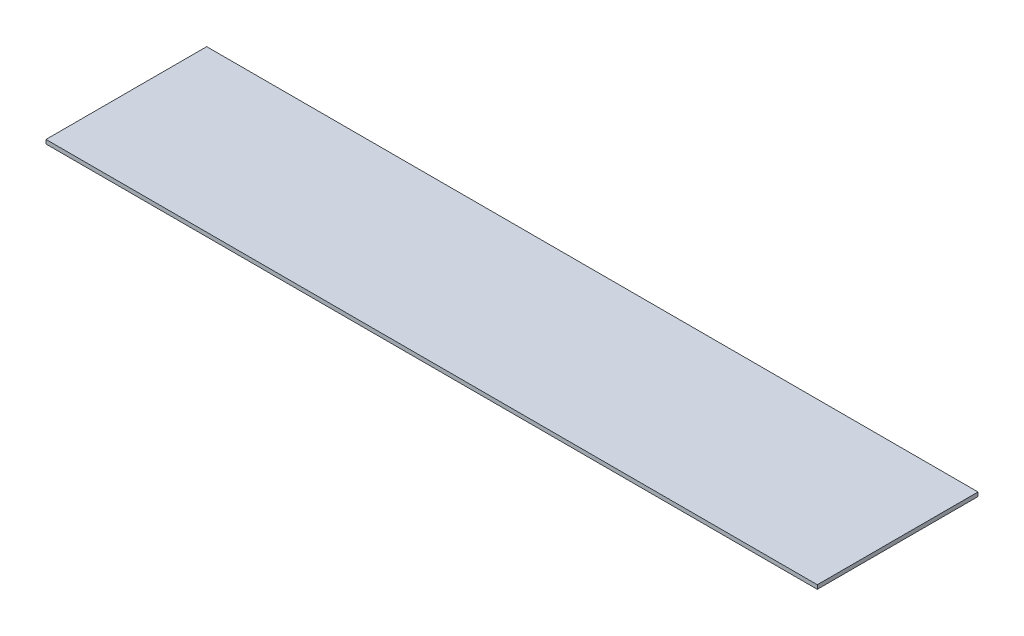
ISO-10303-21;
HEADER;
FILE_DESCRIPTION(('STEP AP214'),'2;1');
FILE_NAME('part.step','',(''),(''),'','','');
FILE_SCHEMA(('AUTOMOTIVE_DESIGN { 1 0 10303 214 1 1 1 1 }'));
ENDSEC;
DATA;
#1=APPLICATION_CONTEXT('core data for automotive mechanical design processes');
#2=APPLICATION_PROTOCOL_DEFINITION('international standard','automotive_design',2000,#1);
#3=PRODUCT_CONTEXT('',#1,'mechanical');
#4=PRODUCT('Part','Part','',(#3));
#5=PRODUCT_RELATED_PRODUCT_CATEGORY('part','',(#4));
#6=PRODUCT_DEFINITION_FORMATION('','',#4);
#7=PRODUCT_DEFINITION_CONTEXT('part definition',#1,'design');
#8=PRODUCT_DEFINITION('design','',#6,#7);
#9=PRODUCT_DEFINITION_SHAPE('','',#8);
#10=(LENGTH_UNIT() NAMED_UNIT(*) SI_UNIT(.MILLI.,.METRE.));
#11=(NAMED_UNIT(*) PLANE_ANGLE_UNIT() SI_UNIT($,.RADIAN.));
#12=(NAMED_UNIT(*) SI_UNIT($,.STERADIAN.) SOLID_ANGLE_UNIT());
#13=UNCERTAINTY_MEASURE_WITH_UNIT(LENGTH_MEASURE(1.E-05),#10,'distance_accuracy_value','');
#14=(GEOMETRIC_REPRESENTATION_CONTEXT(3) GLOBAL_UNCERTAINTY_ASSIGNED_CONTEXT((#13)) GLOBAL_UNIT_ASSIGNED_CONTEXT((#10,
#11,#12)) REPRESENTATION_CONTEXT('',''));
#15=CARTESIAN_POINT('',(0.,0.,0.));
#16=DIRECTION('',(0.,0.,1.));
#17=DIRECTION('',(1.,0.,0.));
#18=AXIS2_PLACEMENT_3D('',#15,#16,#17);
#19=CARTESIAN_POINT('',(0.,6.35,0.));
#20=DIRECTION('',(1.,0.,0.));
#21=DIRECTION('',(0.,0.,-1.));
#22=AXIS2_PLACEMENT_3D('',#19,#20,#21);
#23=PLANE('',#22);
#24=DIRECTION('',(0.,0.,1.));
#25=VECTOR('',#24,1.);
#26=CARTESIAN_POINT('',(0.,0.,0.));
#27=LINE('',#26,#25);
#28=CARTESIAN_POINT('',(0.,0.,-254.));
#29=VERTEX_POINT('',#28);
#30=CARTESIAN_POINT('',(0.,0.,0.));
#31=VERTEX_POINT('',#30);
#32=EDGE_CURVE('E95',#29,#31,#27,.T.);
#33=ORIENTED_EDGE('',*,*,#32,.T.);
#34=DIRECTION('',(0.,-1.,0.));
#35=VECTOR('',#34,1.);
#36=CARTESIAN_POINT('',(0.,6.35,0.));
#37=LINE('',#36,#35);
#38=CARTESIAN_POINT('',(0.,6.35,0.));
#39=VERTEX_POINT('',#38);
#40=EDGE_CURVE('E11',#39,#31,#37,.T.);
#41=ORIENTED_EDGE('',*,*,#40,.F.);
#42=DIRECTION('',(0.,0.,1.));
#43=VECTOR('',#42,1.);
#44=CARTESIAN_POINT('',(0.,6.35,0.));
#45=LINE('',#44,#43);
#46=CARTESIAN_POINT('',(0.,6.35,-254.));
#47=VERTEX_POINT('',#46);
#48=EDGE_CURVE('E83',#47,#39,#45,.T.);
#49=ORIENTED_EDGE('',*,*,#48,.F.);
#50=DIRECTION('',(0.,-1.,0.));
#51=VECTOR('',#50,1.);
#52=CARTESIAN_POINT('',(0.,6.35,-254.));
#53=LINE('',#52,#51);
#54=EDGE_CURVE('E91',#47,#29,#53,.T.);
#55=ORIENTED_EDGE('',*,*,#54,.T.);
#56=EDGE_LOOP('',(#33,#41,#49,#55));
#57=FACE_BOUND('',#56,.T.);
#58=ADVANCED_FACE('F32',(#57),#23,.F.);
#59=CARTESIAN_POINT('',(0.,6.35,0.));
#60=DIRECTION('',(0.,0.,-1.));
#61=DIRECTION('',(-1.,0.,0.));
#62=AXIS2_PLACEMENT_3D('',#59,#60,#61);
#63=PLANE('',#62);
#64=DIRECTION('',(1.,0.,0.));
#65=VECTOR('',#64,1.);
#66=CARTESIAN_POINT('',(0.,0.,0.));
#67=LINE('',#66,#65);
#68=CARTESIAN_POINT('',(1219.2,0.,0.));
#69=VERTEX_POINT('',#68);
#70=EDGE_CURVE('E87',#31,#69,#67,.T.);
#71=ORIENTED_EDGE('',*,*,#70,.T.);
#72=DIRECTION('',(0.,-1.,0.));
#73=VECTOR('',#72,1.);
#74=CARTESIAN_POINT('',(1219.2,6.35,0.));
#75=LINE('',#74,#73);
#76=CARTESIAN_POINT('',(1219.2,6.35,0.));
#77=VERTEX_POINT('',#76);
#78=EDGE_CURVE('E40',#77,#69,#75,.T.);
#79=ORIENTED_EDGE('',*,*,#78,.F.);
#80=DIRECTION('',(1.,0.,0.));
#81=VECTOR('',#80,1.);
#82=CARTESIAN_POINT('',(0.,6.35,0.));
#83=LINE('',#82,#81);
#84=EDGE_CURVE('E78',#39,#77,#83,.T.);
#85=ORIENTED_EDGE('',*,*,#84,.F.);
#86=ORIENTED_EDGE('',*,*,#40,.T.);
#87=EDGE_LOOP('',(#71,#79,#85,#86));
#88=FACE_BOUND('',#87,.T.);
#89=ADVANCED_FACE('F86',(#88),#63,.F.);
#90=CARTESIAN_POINT('',(1219.2,6.35,0.));
#91=DIRECTION('',(-1.,0.,0.));
#92=DIRECTION('',(0.,0.,1.));
#93=AXIS2_PLACEMENT_3D('',#90,#91,#92);
#94=PLANE('',#93);
#95=DIRECTION('',(0.,0.,-1.));
#96=VECTOR('',#95,1.);
#97=CARTESIAN_POINT('',(1219.2,0.,0.));
#98=LINE('',#97,#96);
#99=CARTESIAN_POINT('',(1219.2,0.,-254.));
#100=VERTEX_POINT('',#99);
#101=EDGE_CURVE('E65',#69,#100,#98,.T.);
#102=ORIENTED_EDGE('',*,*,#101,.T.);
#103=DIRECTION('',(0.,-1.,0.));
#104=VECTOR('',#103,1.);
#105=CARTESIAN_POINT('',(1219.2,6.35,-254.));
#106=LINE('',#105,#104);
#107=CARTESIAN_POINT('',(1219.2,6.35,-254.));
#108=VERTEX_POINT('',#107);
#109=EDGE_CURVE('E88',#108,#100,#106,.T.);
#110=ORIENTED_EDGE('',*,*,#109,.F.);
#111=DIRECTION('',(0.,0.,-1.));
#112=VECTOR('',#111,1.);
#113=CARTESIAN_POINT('',(1219.2,6.35,0.));
#114=LINE('',#113,#112);
#115=EDGE_CURVE('E81',#77,#108,#114,.T.);
#116=ORIENTED_EDGE('',*,*,#115,.F.);
#117=ORIENTED_EDGE('',*,*,#78,.T.);
#118=EDGE_LOOP('',(#102,#110,#116,#117));
#119=FACE_BOUND('',#118,.T.);
#120=ADVANCED_FACE('F89',(#119),#94,.F.);
#121=CARTESIAN_POINT('',(0.,6.35,-254.));
#122=DIRECTION('',(0.,0.,1.));
#123=DIRECTION('',(1.,0.,0.));
#124=AXIS2_PLACEMENT_3D('',#121,#122,#123);
#125=PLANE('',#124);
#126=DIRECTION('',(-1.,0.,0.));
#127=VECTOR('',#126,1.);
#128=CARTESIAN_POINT('',(0.,0.,-254.));
#129=LINE('',#128,#127);
#130=EDGE_CURVE('E71',#100,#29,#129,.T.);
#131=ORIENTED_EDGE('',*,*,#130,.T.);
#132=ORIENTED_EDGE('',*,*,#54,.F.);
#133=DIRECTION('',(-1.,0.,0.));
#134=VECTOR('',#133,1.);
#135=CARTESIAN_POINT('',(0.,6.35,-254.));
#136=LINE('',#135,#134);
#137=EDGE_CURVE('E48',#108,#47,#136,.T.);
#138=ORIENTED_EDGE('',*,*,#137,.F.);
#139=ORIENTED_EDGE('',*,*,#109,.T.);
#140=EDGE_LOOP('',(#131,#132,#138,#139));
#141=FACE_BOUND('',#140,.T.);
#142=ADVANCED_FACE('F102',(#141),#125,.F.);
#143=CARTESIAN_POINT('',(0.,6.35,-254.));
#144=DIRECTION('',(0.,-1.,0.));
#145=DIRECTION('',(0.,0.,-1.));
#146=AXIS2_PLACEMENT_3D('',#143,#144,#145);
#147=PLANE('',#146);
#148=ORIENTED_EDGE('',*,*,#48,.T.);
#149=ORIENTED_EDGE('',*,*,#84,.T.);
#150=ORIENTED_EDGE('',*,*,#115,.T.);
#151=ORIENTED_EDGE('',*,*,#137,.T.);
#152=EDGE_LOOP('',(#148,#149,#150,#151));
#153=FACE_BOUND('',#152,.T.);
#154=ADVANCED_FACE('F79',(#153),#147,.F.);
#155=CARTESIAN_POINT('',(0.,0.,-254.));
#156=DIRECTION('',(0.,-1.,0.));
#157=DIRECTION('',(0.,0.,-1.));
#158=AXIS2_PLACEMENT_3D('',#155,#156,#157);
#159=PLANE('',#158);
#160=ORIENTED_EDGE('',*,*,#32,.F.);
#161=ORIENTED_EDGE('',*,*,#130,.F.);
#162=ORIENTED_EDGE('',*,*,#101,.F.);
#163=ORIENTED_EDGE('',*,*,#70,.F.);
#164=EDGE_LOOP('',(#160,#161,#162,#163));
#165=FACE_BOUND('',#164,.T.);
#166=ADVANCED_FACE('F105',(#165),#159,.T.);
#167=CLOSED_SHELL('',(#58,#89,#120,#142,#154,#166));
#168=MANIFOLD_SOLID_BREP('B2',#167);
#169=ADVANCED_BREP_SHAPE_REPRESENTATION('',(#18,#168),#14);
#170=SHAPE_DEFINITION_REPRESENTATION(#9,#169);
ENDSEC;
END-ISO-10303-21;
